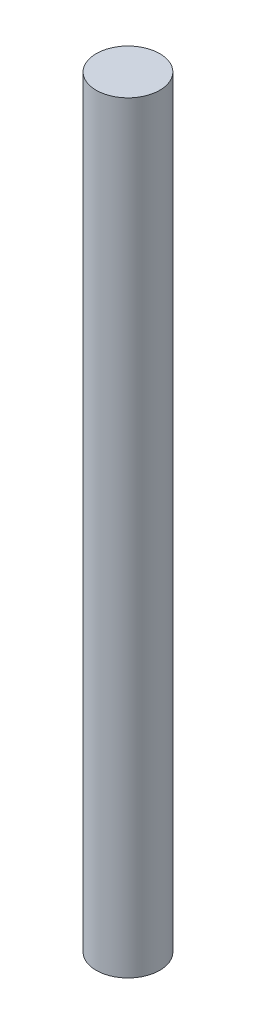
ISO-10303-21;
HEADER;
FILE_DESCRIPTION(('STEP AP214'),'2;1');
FILE_NAME('part.step','',(''),(''),'','','');
FILE_SCHEMA(('AUTOMOTIVE_DESIGN { 1 0 10303 214 1 1 1 1 }'));
ENDSEC;
DATA;
#1=APPLICATION_CONTEXT('core data for automotive mechanical design processes');
#2=APPLICATION_PROTOCOL_DEFINITION('international standard','automotive_design',2000,#1);
#3=PRODUCT_CONTEXT('',#1,'mechanical');
#4=PRODUCT('Part','Part','',(#3));
#5=PRODUCT_RELATED_PRODUCT_CATEGORY('part','',(#4));
#6=PRODUCT_DEFINITION_FORMATION('','',#4);
#7=PRODUCT_DEFINITION_CONTEXT('part definition',#1,'design');
#8=PRODUCT_DEFINITION('design','',#6,#7);
#9=PRODUCT_DEFINITION_SHAPE('','',#8);
#10=(LENGTH_UNIT() NAMED_UNIT(*) SI_UNIT(.MILLI.,.METRE.));
#11=(NAMED_UNIT(*) PLANE_ANGLE_UNIT() SI_UNIT($,.RADIAN.));
#12=(NAMED_UNIT(*) SI_UNIT($,.STERADIAN.) SOLID_ANGLE_UNIT());
#13=UNCERTAINTY_MEASURE_WITH_UNIT(LENGTH_MEASURE(1.E-05),#10,'distance_accuracy_value','');
#14=(GEOMETRIC_REPRESENTATION_CONTEXT(3) GLOBAL_UNCERTAINTY_ASSIGNED_CONTEXT((#13)) GLOBAL_UNIT_ASSIGNED_CONTEXT((#10,
#11,#12)) REPRESENTATION_CONTEXT('',''));
#15=CARTESIAN_POINT('',(0.,0.,0.));
#16=DIRECTION('',(0.,0.,1.));
#17=DIRECTION('',(1.,0.,0.));
#18=AXIS2_PLACEMENT_3D('',#15,#16,#17);
#19=CARTESIAN_POINT('',(0.,28.575,0.));
#20=DIRECTION('',(0.,-1.,0.));
#21=DIRECTION('',(0.,0.,-1.));
#22=AXIS2_PLACEMENT_3D('',#19,#20,#21);
#23=CYLINDRICAL_SURFACE('',#22,1.190625);
#24=CARTESIAN_POINT('',(0.,28.575,0.));
#25=DIRECTION('',(0.,1.,0.));
#26=DIRECTION('',(0.,0.,1.));
#27=AXIS2_PLACEMENT_3D('',#24,#25,#26);
#28=CIRCLE('',#27,1.190625);
#29=CARTESIAN_POINT('',(0.,28.575,1.190625));
#30=VERTEX_POINT('',#29);
#31=EDGE_CURVE('E10',#30,#30,#28,.T.);
#32=ORIENTED_EDGE('',*,*,#31,.F.);
#33=EDGE_LOOP('',(#32));
#34=FACE_BOUND('',#33,.T.);
#35=CARTESIAN_POINT('',(0.,0.,0.));
#36=DIRECTION('',(0.,1.,0.));
#37=DIRECTION('',(0.,0.,1.));
#38=AXIS2_PLACEMENT_3D('',#35,#36,#37);
#39=CIRCLE('',#38,1.190625);
#40=CARTESIAN_POINT('',(0.,0.,1.190625));
#41=VERTEX_POINT('',#40);
#42=EDGE_CURVE('E36',#41,#41,#39,.T.);
#43=ORIENTED_EDGE('',*,*,#42,.T.);
#44=EDGE_LOOP('',(#43));
#45=FACE_BOUND('',#44,.T.);
#46=ADVANCED_FACE('F33',(#34,#45),#23,.T.);
#47=CARTESIAN_POINT('',(0.,28.575,0.));
#48=DIRECTION('',(0.,1.,0.));
#49=DIRECTION('',(0.,0.,1.));
#50=AXIS2_PLACEMENT_3D('',#47,#48,#49);
#51=PLANE('',#50);
#52=ORIENTED_EDGE('',*,*,#31,.T.);
#53=EDGE_LOOP('',(#52));
#54=FACE_BOUND('',#53,.T.);
#55=ADVANCED_FACE('F48',(#54),#51,.T.);
#56=CARTESIAN_POINT('',(0.,0.,0.));
#57=DIRECTION('',(0.,1.,0.));
#58=DIRECTION('',(0.,0.,1.));
#59=AXIS2_PLACEMENT_3D('',#56,#57,#58);
#60=PLANE('',#59);
#61=ORIENTED_EDGE('',*,*,#42,.F.);
#62=EDGE_LOOP('',(#61));
#63=FACE_BOUND('',#62,.T.);
#64=ADVANCED_FACE('F46',(#63),#60,.F.);
#65=CLOSED_SHELL('',(#46,#55,#64));
#66=MANIFOLD_SOLID_BREP('B2',#65);
#67=ADVANCED_BREP_SHAPE_REPRESENTATION('',(#18,#66),#14);
#68=SHAPE_DEFINITION_REPRESENTATION(#9,#67);
ENDSEC;
END-ISO-10303-21;
